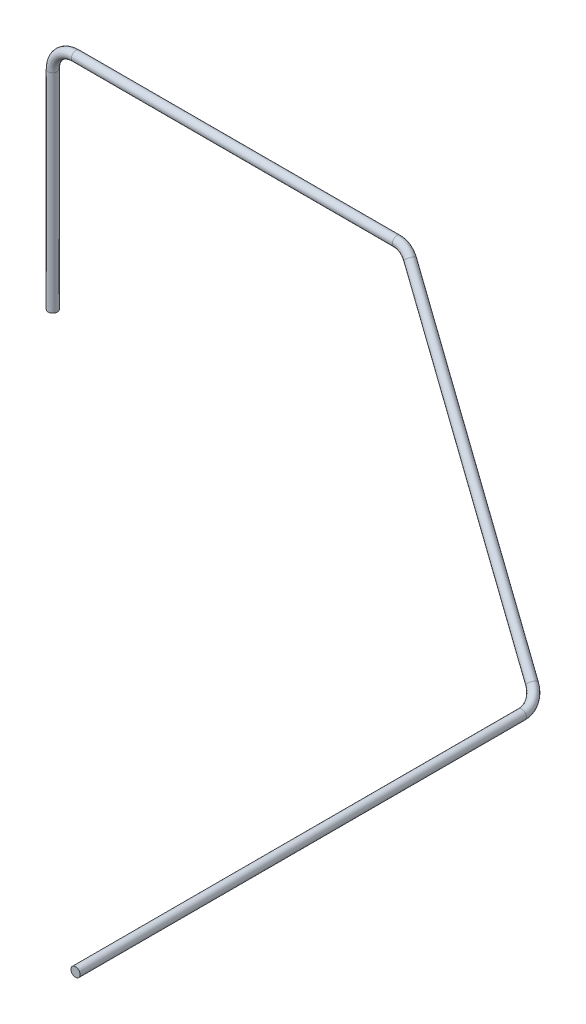
ISO-10303-21;
HEADER;
FILE_DESCRIPTION(('STEP AP214'),'2;1');
FILE_NAME('part.step','',(''),(''),'','','');
FILE_SCHEMA(('AUTOMOTIVE_DESIGN { 1 0 10303 214 1 1 1 1 }'));
ENDSEC;
DATA;
#1=APPLICATION_CONTEXT('core data for automotive mechanical design processes');
#2=APPLICATION_PROTOCOL_DEFINITION('international standard','automotive_design',2000,#1);
#3=PRODUCT_CONTEXT('',#1,'mechanical');
#4=PRODUCT('Part','Part','',(#3));
#5=PRODUCT_RELATED_PRODUCT_CATEGORY('part','',(#4));
#6=PRODUCT_DEFINITION_FORMATION('','',#4);
#7=PRODUCT_DEFINITION_CONTEXT('part definition',#1,'design');
#8=PRODUCT_DEFINITION('design','',#6,#7);
#9=PRODUCT_DEFINITION_SHAPE('','',#8);
#10=(LENGTH_UNIT() NAMED_UNIT(*) SI_UNIT(.MILLI.,.METRE.));
#11=(NAMED_UNIT(*) PLANE_ANGLE_UNIT() SI_UNIT($,.RADIAN.));
#12=(NAMED_UNIT(*) SI_UNIT($,.STERADIAN.) SOLID_ANGLE_UNIT());
#13=UNCERTAINTY_MEASURE_WITH_UNIT(LENGTH_MEASURE(1.E-05),#10,'distance_accuracy_value','');
#14=(GEOMETRIC_REPRESENTATION_CONTEXT(3) GLOBAL_UNCERTAINTY_ASSIGNED_CONTEXT((#13)) GLOBAL_UNIT_ASSIGNED_CONTEXT((#10,
#11,#12)) REPRESENTATION_CONTEXT('',''));
#15=CARTESIAN_POINT('',(0.,0.,0.));
#16=DIRECTION('',(0.,0.,1.));
#17=DIRECTION('',(1.,0.,0.));
#18=AXIS2_PLACEMENT_3D('',#15,#16,#17);
#19=CARTESIAN_POINT('',(0.,0.,0.));
#20=DIRECTION('',(0.,1.,0.));
#21=DIRECTION('',(0.,0.,1.));
#22=AXIS2_PLACEMENT_3D('',#19,#20,#21);
#23=PLANE('',#22);
#24=CARTESIAN_POINT('',(0.,0.,0.));
#25=DIRECTION('',(0.,1.,0.));
#26=DIRECTION('',(0.,0.,1.));
#27=AXIS2_PLACEMENT_3D('',#24,#25,#26);
#28=CIRCLE('',#27,2.);
#29=CARTESIAN_POINT('',(0.,0.,2.));
#30=VERTEX_POINT('',#29);
#31=EDGE_CURVE('E65',#30,#30,#28,.T.);
#32=ORIENTED_EDGE('',*,*,#31,.F.);
#33=EDGE_LOOP('',(#32));
#34=FACE_BOUND('',#33,.T.);
#35=ADVANCED_FACE('F37',(#34),#23,.F.);
#36=CARTESIAN_POINT('',(258.948949364513,6.00056984992338,249.133564204736));
#37=DIRECTION('',(0.,0.,1.));
#38=DIRECTION('',(-0.826717770143027,0.562616857665803,0.));
#39=AXIS2_PLACEMENT_3D('',#36,#37,#38);
#40=PLANE('',#39);
#41=CARTESIAN_POINT('',(258.948949364513,6.00056984992338,249.133564204736));
#42=DIRECTION('',(0.,0.,1.));
#43=DIRECTION('',(-0.826717770143027,0.562616857665803,0.));
#44=AXIS2_PLACEMENT_3D('',#41,#42,#43);
#45=CIRCLE('',#44,2.);
#46=CARTESIAN_POINT('',(257.295513824227,7.12580356525499,249.133564204736));
#47=VERTEX_POINT('',#46);
#48=EDGE_CURVE('E10',#47,#47,#45,.T.);
#49=ORIENTED_EDGE('',*,*,#48,.T.);
#50=EDGE_LOOP('',(#49));
#51=FACE_BOUND('',#50,.T.);
#52=ADVANCED_FACE('F72',(#51),#40,.T.);
#53=CARTESIAN_POINT('',(0.,0.,0.));
#54=DIRECTION('',(0.,1.,0.));
#55=DIRECTION('',(0.,0.,1.));
#56=AXIS2_PLACEMENT_3D('',#53,#54,#55);
#57=CYLINDRICAL_SURFACE('',#56,2.);
#58=CARTESIAN_POINT('',(0.,90.,0.));
#59=DIRECTION('',(0.,1.,0.));
#60=DIRECTION('',(0.,0.,1.));
#61=AXIS2_PLACEMENT_3D('',#58,#59,#60);
#62=CIRCLE('',#61,2.);
#63=CARTESIAN_POINT('',(-2.00000000000001,90.,0.));
#64=VERTEX_POINT('',#63);
#65=EDGE_CURVE('E62',#64,#64,#62,.T.);
#66=ORIENTED_EDGE('',*,*,#65,.F.);
#67=EDGE_LOOP('',(#66));
#68=FACE_BOUND('',#67,.T.);
#69=ORIENTED_EDGE('',*,*,#31,.T.);
#70=EDGE_LOOP('',(#69));
#71=FACE_BOUND('',#70,.T.);
#72=ADVANCED_FACE('F69',(#68,#71),#57,.T.);
#73=CARTESIAN_POINT('',(10.,90.,0.));
#74=DIRECTION('',(0.,0.,-1.));
#75=DIRECTION('',(-1.,0.,0.));
#76=AXIS2_PLACEMENT_3D('',#73,#74,#75);
#77=TOROIDAL_SURFACE('',#76,10.,2.);
#78=CARTESIAN_POINT('',(10.,100.,0.));
#79=DIRECTION('',(1.,0.,0.));
#80=DIRECTION('',(0.,0.,1.));
#81=AXIS2_PLACEMENT_3D('',#78,#79,#80);
#82=CIRCLE('',#81,2.);
#83=CARTESIAN_POINT('',(10.,102.,0.));
#84=VERTEX_POINT('',#83);
#85=EDGE_CURVE('E59',#84,#84,#82,.T.);
#86=CARTESIAN_POINT('',(10.,90.,0.));
#87=DIRECTION('',(0.,0.,-1.));
#88=DIRECTION('',(-1.,0.,0.));
#89=AXIS2_PLACEMENT_3D('',#86,#87,#88);
#90=CIRCLE('',#89,12.);
#91=EDGE_CURVE('',#64,#84,#90,.T.);
#92=ORIENTED_EDGE('',*,*,#65,.T.);
#93=ORIENTED_EDGE('',*,*,#85,.F.);
#94=ORIENTED_EDGE('',*,*,#91,.T.);
#95=ORIENTED_EDGE('',*,*,#91,.F.);
#96=EDGE_LOOP('',(#92,#94,#93,#95));
#97=FACE_BOUND('',#96,.T.);
#98=ADVANCED_FACE('F98',(#97),#77,.T.);
#99=CARTESIAN_POINT('',(10.,100.,0.));
#100=DIRECTION('',(1.,0.,0.));
#101=DIRECTION('',(0.,0.,-1.));
#102=AXIS2_PLACEMENT_3D('',#99,#100,#101);
#103=CYLINDRICAL_SURFACE('',#102,2.);
#104=CARTESIAN_POINT('',(148.7407965628,100.,0.));
#105=DIRECTION('',(1.,0.,0.));
#106=DIRECTION('',(0.,0.,1.));
#107=AXIS2_PLACEMENT_3D('',#104,#105,#106);
#108=CIRCLE('',#107,2.);
#109=CARTESIAN_POINT('',(148.7407965628,101.772470252981,-0.926471371547582));
#110=VERTEX_POINT('',#109);
#111=EDGE_CURVE('E56',#110,#110,#108,.T.);
#112=ORIENTED_EDGE('',*,*,#111,.F.);
#113=EDGE_LOOP('',(#112));
#114=FACE_BOUND('',#113,.T.);
#115=ORIENTED_EDGE('',*,*,#85,.T.);
#116=EDGE_LOOP('',(#115));
#117=FACE_BOUND('',#116,.T.);
#118=ADVANCED_FACE('F94',(#114,#117),#103,.T.);
#119=CARTESIAN_POINT('',(148.7407965628,91.1376487350946,4.63235685773778));
#120=DIRECTION('',(0.,-0.463235685773778,-0.886235126490536));
#121=DIRECTION('',(0.,0.886235126490536,-0.463235685773778));
#122=AXIS2_PLACEMENT_3D('',#119,#120,#121);
#123=TOROIDAL_SURFACE('',#122,10.,2.);
#124=CARTESIAN_POINT('',(155.811864374665,97.4042774117664,1.35678591075537));
#125=DIRECTION('',(0.70710678118655,-0.626662867667174,0.327557094698238));
#126=DIRECTION('',(-0.327557094698238,0.120243133323887,0.937148834818303));
#127=AXIS2_PLACEMENT_3D('',#124,#125,#126);
#128=CIRCLE('',#127,2.);
#129=CARTESIAN_POINT('',(157.226077937039,98.6576031471008,0.701671721358891));
#130=VERTEX_POINT('',#129);
#131=EDGE_CURVE('E51',#130,#130,#128,.T.);
#132=CARTESIAN_POINT('',(148.7407965628,91.1376487350946,4.63235685773778));
#133=DIRECTION('',(0.,-0.463235685773778,-0.886235126490536));
#134=DIRECTION('',(0.,0.886235126490536,-0.463235685773778));
#135=AXIS2_PLACEMENT_3D('',#132,#133,#134);
#136=CIRCLE('',#135,12.);
#137=EDGE_CURVE('',#110,#130,#136,.T.);
#138=ORIENTED_EDGE('',*,*,#111,.T.);
#139=ORIENTED_EDGE('',*,*,#131,.F.);
#140=ORIENTED_EDGE('',*,*,#137,.T.);
#141=ORIENTED_EDGE('',*,*,#137,.F.);
#142=EDGE_LOOP('',(#138,#140,#139,#141));
#143=FACE_BOUND('',#142,.T.);
#144=ADVANCED_FACE('F90',(#143),#123,.T.);
#145=CARTESIAN_POINT('',(155.811864374665,97.4042774117664,1.35678591075536));
#146=DIRECTION('',(0.707106781186546,-0.626662867667178,0.32755709469824));
#147=DIRECTION('',(0.663253651753365,0.748394677583844,0.));
#148=AXIS2_PLACEMENT_3D('',#145,#146,#147);
#149=CYLINDRICAL_SURFACE('',#148,2.);
#150=CARTESIAN_POINT('',(253.916422451444,10.4605719752937,46.8023181489856));
#151=DIRECTION('',(0.707106781186546,-0.626662867667178,0.32755709469824));
#152=DIRECTION('',(-0.32755709469824,0.120243133323889,0.937148834818302));
#153=AXIS2_PLACEMENT_3D('',#150,#151,#152);
#154=CIRCLE('',#153,2.);
#155=CARTESIAN_POINT('',(254.406706423998,10.026065096861,44.9126553751418));
#156=VERTEX_POINT('',#155);
#157=EDGE_CURVE('E47',#156,#156,#154,.T.);
#158=ORIENTED_EDGE('',*,*,#157,.F.);
#159=EDGE_LOOP('',(#158));
#160=FACE_BOUND('',#159,.T.);
#161=ORIENTED_EDGE('',*,*,#131,.T.);
#162=EDGE_LOOP('',(#161));
#163=FACE_BOUND('',#162,.T.);
#164=ADVANCED_FACE('F84',(#160,#163),#149,.T.);
#165=CARTESIAN_POINT('',(251.465002588674,12.633106367457,56.2506320182051));
#166=DIRECTION('',(-0.663253651753365,-0.748394677583844,0.));
#167=DIRECTION('',(0.748394677583844,-0.663253651753365,0.));
#168=AXIS2_PLACEMENT_3D('',#165,#166,#167);
#169=TOROIDAL_SURFACE('',#168,9.99999999999999,2.);
#170=CARTESIAN_POINT('',(258.948949364513,6.00056984992339,56.2506320182051));
#171=DIRECTION('',(0.,0.,1.));
#172=DIRECTION('',(-0.826717770143027,0.562616857665803,0.));
#173=AXIS2_PLACEMENT_3D('',#170,#171,#172);
#174=CIRCLE('',#173,2.);
#175=CARTESIAN_POINT('',(260.445738719681,4.67406254641665,56.2506320182051));
#176=VERTEX_POINT('',#175);
#177=EDGE_CURVE('E43',#176,#176,#174,.T.);
#178=CARTESIAN_POINT('',(251.465002588674,12.633106367457,56.2506320182051));
#179=DIRECTION('',(-0.663253651753365,-0.748394677583844,0.));
#180=DIRECTION('',(0.748394677583844,-0.663253651753365,0.));
#181=AXIS2_PLACEMENT_3D('',#178,#179,#180);
#182=CIRCLE('',#181,12.);
#183=EDGE_CURVE('',#156,#176,#182,.T.);
#184=ORIENTED_EDGE('',*,*,#157,.T.);
#185=ORIENTED_EDGE('',*,*,#177,.F.);
#186=ORIENTED_EDGE('',*,*,#183,.T.);
#187=ORIENTED_EDGE('',*,*,#183,.F.);
#188=EDGE_LOOP('',(#184,#186,#185,#187));
#189=FACE_BOUND('',#188,.T.);
#190=ADVANCED_FACE('F78',(#189),#169,.T.);
#191=CARTESIAN_POINT('',(258.948949364513,6.00056984992339,56.2506320182051));
#192=DIRECTION('',(0.,0.,1.));
#193=DIRECTION('',(0.,-1.,0.));
#194=AXIS2_PLACEMENT_3D('',#191,#192,#193);
#195=CYLINDRICAL_SURFACE('',#194,2.);
#196=ORIENTED_EDGE('',*,*,#48,.F.);
#197=EDGE_LOOP('',(#196));
#198=FACE_BOUND('',#197,.T.);
#199=ORIENTED_EDGE('',*,*,#177,.T.);
#200=EDGE_LOOP('',(#199));
#201=FACE_BOUND('',#200,.T.);
#202=ADVANCED_FACE('F76',(#198,#201),#195,.T.);
#203=CLOSED_SHELL('',(#35,#52,#72,#98,#118,#144,#164,#190,#202));
#204=MANIFOLD_SOLID_BREP('B2',#203);
#205=ADVANCED_BREP_SHAPE_REPRESENTATION('',(#18,#204),#14);
#206=SHAPE_DEFINITION_REPRESENTATION(#9,#205);
ENDSEC;
END-ISO-10303-21;
